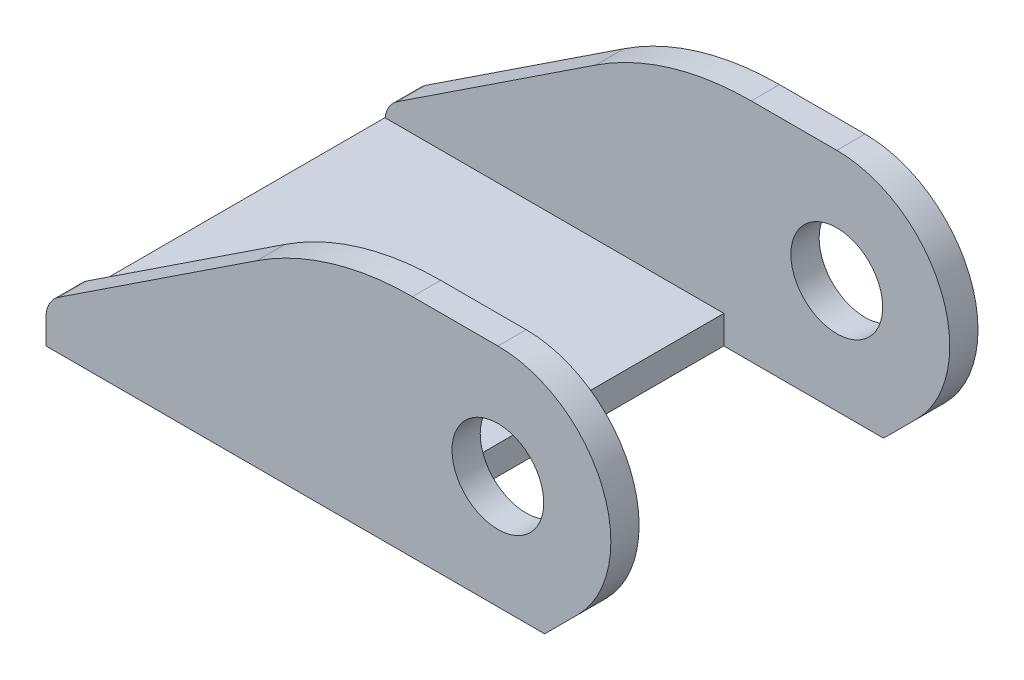
ISO-10303-21;
HEADER;
FILE_DESCRIPTION(('STEP AP214'),'2;1');
FILE_NAME('part.step','',(''),(''),'','','');
FILE_SCHEMA(('AUTOMOTIVE_DESIGN { 1 0 10303 214 1 1 1 1 }'));
ENDSEC;
DATA;
#1=APPLICATION_CONTEXT('core data for automotive mechanical design processes');
#2=APPLICATION_PROTOCOL_DEFINITION('international standard','automotive_design',2000,#1);
#3=PRODUCT_CONTEXT('',#1,'mechanical');
#4=PRODUCT('Part','Part','',(#3));
#5=PRODUCT_RELATED_PRODUCT_CATEGORY('part','',(#4));
#6=PRODUCT_DEFINITION_FORMATION('','',#4);
#7=PRODUCT_DEFINITION_CONTEXT('part definition',#1,'design');
#8=PRODUCT_DEFINITION('design','',#6,#7);
#9=PRODUCT_DEFINITION_SHAPE('','',#8);
#10=(LENGTH_UNIT() NAMED_UNIT(*) SI_UNIT(.MILLI.,.METRE.));
#11=(NAMED_UNIT(*) PLANE_ANGLE_UNIT() SI_UNIT($,.RADIAN.));
#12=(NAMED_UNIT(*) SI_UNIT($,.STERADIAN.) SOLID_ANGLE_UNIT());
#13=UNCERTAINTY_MEASURE_WITH_UNIT(LENGTH_MEASURE(1.E-05),#10,'distance_accuracy_value','');
#14=(GEOMETRIC_REPRESENTATION_CONTEXT(3) GLOBAL_UNCERTAINTY_ASSIGNED_CONTEXT((#13)) GLOBAL_UNIT_ASSIGNED_CONTEXT((#10,
#11,#12)) REPRESENTATION_CONTEXT('',''));
#15=CARTESIAN_POINT('',(0.,0.,0.));
#16=DIRECTION('',(0.,0.,1.));
#17=DIRECTION('',(1.,0.,0.));
#18=AXIS2_PLACEMENT_3D('',#15,#16,#17);
#19=CARTESIAN_POINT('',(3.99993351473138,2.,-13.));
#20=DIRECTION('',(-1.,0.,0.));
#21=DIRECTION('',(0.,0.,1.));
#22=AXIS2_PLACEMENT_3D('',#19,#20,#21);
#23=PLANE('',#22);
#24=DIRECTION('',(0.,1.,0.));
#25=VECTOR('',#24,1.);
#26=CARTESIAN_POINT('',(3.9999335147313,2.,11.));
#27=LINE('',#26,#25);
#28=CARTESIAN_POINT('',(3.9999335147313,0.,11.));
#29=VERTEX_POINT('',#28);
#30=CARTESIAN_POINT('',(3.9999335147313,2.,11.));
#31=VERTEX_POINT('',#30);
#32=EDGE_CURVE('E47',#29,#31,#27,.T.);
#33=ORIENTED_EDGE('',*,*,#32,.F.);
#34=DIRECTION('',(0.,0.,-1.));
#35=VECTOR('',#34,1.);
#36=CARTESIAN_POINT('',(3.99993351473138,0.,-13.));
#37=LINE('',#36,#35);
#38=CARTESIAN_POINT('',(3.99993351473137,0.,-11.));
#39=VERTEX_POINT('',#38);
#40=EDGE_CURVE('E233',#29,#39,#37,.T.);
#41=ORIENTED_EDGE('',*,*,#40,.T.);
#42=DIRECTION('',(0.,1.,0.));
#43=VECTOR('',#42,1.);
#44=CARTESIAN_POINT('',(3.99993351473137,16.,-11.));
#45=LINE('',#44,#43);
#46=CARTESIAN_POINT('',(3.99993351473137,2.,-11.));
#47=VERTEX_POINT('',#46);
#48=EDGE_CURVE('E253',#39,#47,#45,.T.);
#49=ORIENTED_EDGE('',*,*,#48,.T.);
#50=DIRECTION('',(0.,0.,-1.));
#51=VECTOR('',#50,1.);
#52=CARTESIAN_POINT('',(3.99993351473138,2.,-13.));
#53=LINE('',#52,#51);
#54=EDGE_CURVE('E236',#31,#47,#53,.T.);
#55=ORIENTED_EDGE('',*,*,#54,.F.);
#56=EDGE_LOOP('',(#33,#41,#49,#55));
#57=FACE_BOUND('',#56,.T.);
#58=ADVANCED_FACE('F32',(#57),#23,.F.);
#59=CARTESIAN_POINT('',(0.,2.,0.));
#60=DIRECTION('',(0.,1.,0.));
#61=DIRECTION('',(0.,0.,1.));
#62=AXIS2_PLACEMENT_3D('',#59,#60,#61);
#63=PLANE('',#62);
#64=CARTESIAN_POINT('',(-3.00004785437869,2.,0.));
#65=DIRECTION('',(0.,1.,0.));
#66=DIRECTION('',(0.,0.,1.));
#67=AXIS2_PLACEMENT_3D('',#64,#65,#66);
#68=CIRCLE('',#67,1.75);
#69=CARTESIAN_POINT('',(-3.00004785437869,2.,1.75000000000001));
#70=VERTEX_POINT('',#69);
#71=EDGE_CURVE('E224',#70,#70,#68,.T.);
#72=ORIENTED_EDGE('',*,*,#71,.F.);
#73=EDGE_LOOP('',(#72));
#74=FACE_BOUND('',#73,.T.);
#75=CARTESIAN_POINT('',(-13.0000478543787,2.,0.));
#76=DIRECTION('',(0.,1.,0.));
#77=DIRECTION('',(0.,0.,1.));
#78=AXIS2_PLACEMENT_3D('',#75,#76,#77);
#79=CIRCLE('',#78,1.75);
#80=CARTESIAN_POINT('',(-13.0000478543787,2.,1.75));
#81=VERTEX_POINT('',#80);
#82=EDGE_CURVE('E230',#81,#81,#79,.T.);
#83=ORIENTED_EDGE('',*,*,#82,.F.);
#84=EDGE_LOOP('',(#83));
#85=FACE_BOUND('',#84,.T.);
#86=DIRECTION('',(0.,0.,-1.));
#87=VECTOR('',#86,1.);
#88=CARTESIAN_POINT('',(-19.9864100152083,2.,27.));
#89=LINE('',#88,#87);
#90=CARTESIAN_POINT('',(-19.9864100152083,2.,11.));
#91=VERTEX_POINT('',#90);
#92=CARTESIAN_POINT('',(-19.9864100152083,2.,13.));
#93=VERTEX_POINT('',#92);
#94=EDGE_CURVE('E54',#91,#93,#89,.F.);
#95=ORIENTED_EDGE('',*,*,#94,.F.);
#96=DIRECTION('',(1.,0.,0.));
#97=VECTOR('',#96,1.);
#98=CARTESIAN_POINT('',(0.,2.,11.));
#99=LINE('',#98,#97);
#100=EDGE_CURVE('E11',#91,#31,#99,.T.);
#101=ORIENTED_EDGE('',*,*,#100,.T.);
#102=ORIENTED_EDGE('',*,*,#54,.T.);
#103=DIRECTION('',(1.,0.,0.));
#104=VECTOR('',#103,1.);
#105=CARTESIAN_POINT('',(-20.,2.,-11.));
#106=LINE('',#105,#104);
#107=CARTESIAN_POINT('',(-19.9864100152083,2.,-11.));
#108=VERTEX_POINT('',#107);
#109=EDGE_CURVE('E250',#108,#47,#106,.T.);
#110=ORIENTED_EDGE('',*,*,#109,.F.);
#111=DIRECTION('',(0.,0.,1.));
#112=VECTOR('',#111,1.);
#113=CARTESIAN_POINT('',(-19.9864100152083,2.,-27.));
#114=LINE('',#113,#112);
#115=CARTESIAN_POINT('',(-19.9864100152083,2.,-13.));
#116=VERTEX_POINT('',#115);
#117=EDGE_CURVE('E40',#108,#116,#114,.F.);
#118=ORIENTED_EDGE('',*,*,#117,.T.);
#119=DIRECTION('',(-1.,0.,0.));
#120=VECTOR('',#119,1.);
#121=CARTESIAN_POINT('',(-20.,2.,-13.));
#122=LINE('',#121,#120);
#123=CARTESIAN_POINT('',(-20.,2.,-13.));
#124=VERTEX_POINT('',#123);
#125=EDGE_CURVE('E238',#116,#124,#122,.T.);
#126=ORIENTED_EDGE('',*,*,#125,.T.);
#127=DIRECTION('',(0.,0.,1.));
#128=VECTOR('',#127,1.);
#129=CARTESIAN_POINT('',(-20.,2.,-13.));
#130=LINE('',#129,#128);
#131=CARTESIAN_POINT('',(-20.,2.,13.));
#132=VERTEX_POINT('',#131);
#133=EDGE_CURVE('E242',#124,#132,#130,.T.);
#134=ORIENTED_EDGE('',*,*,#133,.T.);
#135=DIRECTION('',(1.,0.,0.));
#136=VECTOR('',#135,1.);
#137=CARTESIAN_POINT('',(-20.,2.,13.));
#138=LINE('',#137,#136);
#139=EDGE_CURVE('E244',#132,#93,#138,.T.);
#140=ORIENTED_EDGE('',*,*,#139,.T.);
#141=EDGE_LOOP('',(#95,#101,#102,#110,#118,#126,#134,#140));
#142=FACE_BOUND('',#141,.T.);
#143=ADVANCED_FACE('F328',(#74,#85,#142),#63,.T.);
#144=CARTESIAN_POINT('',(-20.,16.,-13.));
#145=DIRECTION('',(0.,0.,1.));
#146=DIRECTION('',(-1.,0.,0.));
#147=AXIS2_PLACEMENT_3D('',#144,#145,#146);
#148=PLANE('',#147);
#149=ORIENTED_EDGE('',*,*,#125,.F.);
#150=CARTESIAN_POINT('',(-18.,1.76724422353022,-13.));
#151=DIRECTION('',(0.,0.,-1.));
#152=DIRECTION('',(-1.,0.,0.));
#153=AXIS2_PLACEMENT_3D('',#150,#151,#152);
#154=CIRCLE('',#153,2.);
#155=CARTESIAN_POINT('',(-19.1015173941069,3.43657325954439,-13.));
#156=VERTEX_POINT('',#155);
#157=EDGE_CURVE('E284',#116,#156,#154,.T.);
#158=ORIENTED_EDGE('',*,*,#157,.T.);
#159=DIRECTION('',(0.834664518007086,0.550758697053437,0.));
#160=VECTOR('',#159,1.);
#161=CARTESIAN_POINT('',(-13.9520671778136,6.83447077463097,-13.));
#162=LINE('',#161,#160);
#163=CARTESIAN_POINT('',(-5.07313553026432,12.6932903601417,-13.));
#164=VERTEX_POINT('',#163);
#165=EDGE_CURVE('E286',#156,#164,#162,.T.);
#166=ORIENTED_EDGE('',*,*,#165,.T.);
#167=CARTESIAN_POINT('',(5.94203841080447,-4.,-13.));
#168=DIRECTION('',(0.,0.,-1.));
#169=DIRECTION('',(-1.,0.,0.));
#170=AXIS2_PLACEMENT_3D('',#167,#168,#169);
#171=CIRCLE('',#170,20.);
#172=CARTESIAN_POINT('',(5.94203841080447,16.,-13.));
#173=VERTEX_POINT('',#172);
#174=EDGE_CURVE('E273',#164,#173,#171,.T.);
#175=ORIENTED_EDGE('',*,*,#174,.T.);
#176=DIRECTION('',(1.,0.,0.));
#177=VECTOR('',#176,1.);
#178=CARTESIAN_POINT('',(-20.,16.,-13.));
#179=LINE('',#178,#177);
#180=CARTESIAN_POINT('',(12.,16.,-13.));
#181=VERTEX_POINT('',#180);
#182=EDGE_CURVE('E296',#173,#181,#179,.T.);
#183=ORIENTED_EDGE('',*,*,#182,.T.);
#184=CARTESIAN_POINT('',(12.,8.,-13.));
#185=DIRECTION('',(0.,0.,-1.));
#186=DIRECTION('',(-1.,0.,0.));
#187=AXIS2_PLACEMENT_3D('',#184,#185,#186);
#188=CIRCLE('',#187,8.);
#189=CARTESIAN_POINT('',(17.6568542494924,2.34314575050762,-13.));
#190=VERTEX_POINT('',#189);
#191=EDGE_CURVE('E279',#181,#190,#188,.T.);
#192=ORIENTED_EDGE('',*,*,#191,.T.);
#193=DIRECTION('',(-0.707106781186548,-0.707106781186548,0.));
#194=VECTOR('',#193,1.);
#195=CARTESIAN_POINT('',(5.65685424949238,-9.65685424949238,-13.));
#196=LINE('',#195,#194);
#197=CARTESIAN_POINT('',(15.3137084989848,0.,-13.));
#198=VERTEX_POINT('',#197);
#199=EDGE_CURVE('E267',#190,#198,#196,.T.);
#200=ORIENTED_EDGE('',*,*,#199,.T.);
#201=DIRECTION('',(1.,0.,0.));
#202=VECTOR('',#201,1.);
#203=CARTESIAN_POINT('',(-20.,0.,-13.));
#204=LINE('',#203,#202);
#205=CARTESIAN_POINT('',(-20.,0.,-13.));
#206=VERTEX_POINT('',#205);
#207=EDGE_CURVE('E302',#206,#198,#204,.T.);
#208=ORIENTED_EDGE('',*,*,#207,.F.);
#209=DIRECTION('',(0.,-1.,0.));
#210=VECTOR('',#209,1.);
#211=CARTESIAN_POINT('',(-20.,16.,-13.));
#212=LINE('',#211,#210);
#213=EDGE_CURVE('E306',#124,#206,#212,.T.);
#214=ORIENTED_EDGE('',*,*,#213,.F.);
#215=EDGE_LOOP('',(#149,#158,#166,#175,#183,#192,#200,#208,#214));
#216=FACE_BOUND('',#215,.T.);
#217=CARTESIAN_POINT('',(12.,8.,-13.));
#218=DIRECTION('',(0.,0.,-1.));
#219=DIRECTION('',(-1.,0.,0.));
#220=AXIS2_PLACEMENT_3D('',#217,#218,#219);
#221=CIRCLE('',#220,3.25);
#222=CARTESIAN_POINT('',(8.75,8.,-13.));
#223=VERTEX_POINT('',#222);
#224=EDGE_CURVE('E290',#223,#223,#221,.T.);
#225=ORIENTED_EDGE('',*,*,#224,.F.);
#226=EDGE_LOOP('',(#225));
#227=FACE_BOUND('',#226,.T.);
#228=ADVANCED_FACE('F333',(#216,#227),#148,.F.);
#229=CARTESIAN_POINT('',(-20.,16.,-11.));
#230=DIRECTION('',(0.,0.,-1.));
#231=DIRECTION('',(1.,0.,0.));
#232=AXIS2_PLACEMENT_3D('',#229,#230,#231);
#233=PLANE('',#232);
#234=CARTESIAN_POINT('',(12.,8.,-11.));
#235=DIRECTION('',(0.,0.,-1.));
#236=DIRECTION('',(-1.,0.,0.));
#237=AXIS2_PLACEMENT_3D('',#234,#235,#236);
#238=CIRCLE('',#237,3.25);
#239=CARTESIAN_POINT('',(8.75,8.,-11.));
#240=VERTEX_POINT('',#239);
#241=EDGE_CURVE('E289',#240,#240,#238,.T.);
#242=ORIENTED_EDGE('',*,*,#241,.T.);
#243=EDGE_LOOP('',(#242));
#244=FACE_BOUND('',#243,.T.);
#245=CARTESIAN_POINT('',(-18.,1.76724422353022,-11.));
#246=DIRECTION('',(0.,0.,-1.));
#247=DIRECTION('',(-1.,0.,0.));
#248=AXIS2_PLACEMENT_3D('',#245,#246,#247);
#249=CIRCLE('',#248,2.);
#250=CARTESIAN_POINT('',(-19.1015173941069,3.43657325954439,-11.));
#251=VERTEX_POINT('',#250);
#252=EDGE_CURVE('E316',#251,#108,#249,.F.);
#253=ORIENTED_EDGE('',*,*,#252,.T.);
#254=ORIENTED_EDGE('',*,*,#109,.T.);
#255=ORIENTED_EDGE('',*,*,#48,.F.);
#256=DIRECTION('',(-1.,0.,0.));
#257=VECTOR('',#256,1.);
#258=CARTESIAN_POINT('',(-20.,0.,-11.));
#259=LINE('',#258,#257);
#260=CARTESIAN_POINT('',(15.3137084989848,0.,-11.));
#261=VERTEX_POINT('',#260);
#262=EDGE_CURVE('E300',#261,#39,#259,.T.);
#263=ORIENTED_EDGE('',*,*,#262,.F.);
#264=DIRECTION('',(0.707106781186548,0.707106781186548,0.));
#265=VECTOR('',#264,1.);
#266=CARTESIAN_POINT('',(5.65685424949238,-9.65685424949238,-11.));
#267=LINE('',#266,#265);
#268=CARTESIAN_POINT('',(17.6568542494924,2.34314575050762,-10.999994));
#269=VERTEX_POINT('',#268);
#270=EDGE_CURVE('E261',#261,#269,#267,.T.);
#271=ORIENTED_EDGE('',*,*,#270,.T.);
#272=CARTESIAN_POINT('',(12.,8.,-11.));
#273=DIRECTION('',(0.,0.,1.));
#274=DIRECTION('',(1.,0.,0.));
#275=AXIS2_PLACEMENT_3D('',#272,#273,#274);
#276=CIRCLE('',#275,8.);
#277=CARTESIAN_POINT('',(12.,16.,-11.));
#278=VERTEX_POINT('',#277);
#279=EDGE_CURVE('E276',#269,#278,#276,.T.);
#280=ORIENTED_EDGE('',*,*,#279,.T.);
#281=DIRECTION('',(1.,0.,0.));
#282=VECTOR('',#281,1.);
#283=CARTESIAN_POINT('',(0.,16.,-11.));
#284=LINE('',#283,#282);
#285=CARTESIAN_POINT('',(5.94203841080447,16.,-11.));
#286=VERTEX_POINT('',#285);
#287=EDGE_CURVE('E299',#278,#286,#284,.F.);
#288=ORIENTED_EDGE('',*,*,#287,.T.);
#289=CARTESIAN_POINT('',(5.94203841080447,-4.,-11.));
#290=DIRECTION('',(0.,0.,-1.));
#291=DIRECTION('',(-1.,0.,0.));
#292=AXIS2_PLACEMENT_3D('',#289,#290,#291);
#293=CIRCLE('',#292,20.);
#294=CARTESIAN_POINT('',(-5.07313553026429,12.6932903601417,-11.));
#295=VERTEX_POINT('',#294);
#296=EDGE_CURVE('E272',#295,#286,#293,.T.);
#297=ORIENTED_EDGE('',*,*,#296,.F.);
#298=DIRECTION('',(-0.834664518007086,-0.550758697053437,0.));
#299=VECTOR('',#298,1.);
#300=CARTESIAN_POINT('',(-19.1015173941069,3.43657325954439,-11.));
#301=LINE('',#300,#299);
#302=EDGE_CURVE('E319',#295,#251,#301,.T.);
#303=ORIENTED_EDGE('',*,*,#302,.T.);
#304=EDGE_LOOP('',(#253,#254,#255,#263,#271,#280,#288,#297,#303));
#305=FACE_BOUND('',#304,.T.);
#306=ADVANCED_FACE('F374',(#244,#305),#233,.F.);
#307=CARTESIAN_POINT('',(0.,16.,0.));
#308=DIRECTION('',(0.,-1.,0.));
#309=DIRECTION('',(0.,0.,1.));
#310=AXIS2_PLACEMENT_3D('',#307,#308,#309);
#311=PLANE('',#310);
#312=ORIENTED_EDGE('',*,*,#182,.F.);
#313=DIRECTION('',(0.,0.,1.));
#314=VECTOR('',#313,1.);
#315=CARTESIAN_POINT('',(5.94203841080447,16.,-27.));
#316=LINE('',#315,#314);
#317=EDGE_CURVE('E312',#173,#286,#316,.T.);
#318=ORIENTED_EDGE('',*,*,#317,.T.);
#319=ORIENTED_EDGE('',*,*,#287,.F.);
#320=DIRECTION('',(0.,0.,1.));
#321=VECTOR('',#320,1.);
#322=CARTESIAN_POINT('',(12.,16.,-27.));
#323=LINE('',#322,#321);
#324=EDGE_CURVE('E314',#181,#278,#323,.T.);
#325=ORIENTED_EDGE('',*,*,#324,.F.);
#326=EDGE_LOOP('',(#312,#318,#319,#325));
#327=FACE_BOUND('',#326,.T.);
#328=ADVANCED_FACE('F387',(#327),#311,.F.);
#329=CARTESIAN_POINT('',(0.,0.,0.));
#330=DIRECTION('',(0.,-1.,0.));
#331=DIRECTION('',(0.,0.,1.));
#332=AXIS2_PLACEMENT_3D('',#329,#330,#331);
#333=PLANE('',#332);
#334=DIRECTION('',(0.,0.,-1.));
#335=VECTOR('',#334,1.);
#336=CARTESIAN_POINT('',(-20.,0.,-13.));
#337=LINE('',#336,#335);
#338=CARTESIAN_POINT('',(-20.,0.,13.));
#339=VERTEX_POINT('',#338);
#340=EDGE_CURVE('E293',#339,#206,#337,.T.);
#341=ORIENTED_EDGE('',*,*,#340,.T.);
#342=ORIENTED_EDGE('',*,*,#207,.T.);
#343=DIRECTION('',(0.,0.,-1.));
#344=VECTOR('',#343,1.);
#345=CARTESIAN_POINT('',(15.3137084989848,0.,0.));
#346=LINE('',#345,#344);
#347=EDGE_CURVE('E309',#261,#198,#346,.T.);
#348=ORIENTED_EDGE('',*,*,#347,.F.);
#349=ORIENTED_EDGE('',*,*,#262,.T.);
#350=ORIENTED_EDGE('',*,*,#40,.F.);
#351=DIRECTION('',(-1.,0.,0.));
#352=VECTOR('',#351,1.);
#353=CARTESIAN_POINT('',(-20.,0.,11.));
#354=LINE('',#353,#352);
#355=CARTESIAN_POINT('',(15.3137084989848,0.,11.));
#356=VERTEX_POINT('',#355);
#357=EDGE_CURVE('E202',#356,#29,#354,.T.);
#358=ORIENTED_EDGE('',*,*,#357,.F.);
#359=DIRECTION('',(0.,0.,1.));
#360=VECTOR('',#359,1.);
#361=CARTESIAN_POINT('',(15.3137084989848,0.,0.));
#362=LINE('',#361,#360);
#363=CARTESIAN_POINT('',(15.3137084989848,0.,13.));
#364=VERTEX_POINT('',#363);
#365=EDGE_CURVE('E164',#356,#364,#362,.T.);
#366=ORIENTED_EDGE('',*,*,#365,.T.);
#367=DIRECTION('',(1.,0.,0.));
#368=VECTOR('',#367,1.);
#369=CARTESIAN_POINT('',(-20.,0.,13.));
#370=LINE('',#369,#368);
#371=EDGE_CURVE('E239',#339,#364,#370,.T.);
#372=ORIENTED_EDGE('',*,*,#371,.F.);
#373=EDGE_LOOP('',(#341,#342,#348,#349,#350,#358,#366,#372));
#374=FACE_BOUND('',#373,.T.);
#375=CARTESIAN_POINT('',(-13.0000478543787,0.,0.));
#376=DIRECTION('',(0.,1.,0.));
#377=DIRECTION('',(0.,0.,1.));
#378=AXIS2_PLACEMENT_3D('',#375,#376,#377);
#379=CIRCLE('',#378,1.75);
#380=CARTESIAN_POINT('',(-13.0000478543787,0.,1.75));
#381=VERTEX_POINT('',#380);
#382=EDGE_CURVE('E227',#381,#381,#379,.T.);
#383=ORIENTED_EDGE('',*,*,#382,.T.);
#384=EDGE_LOOP('',(#383));
#385=FACE_BOUND('',#384,.T.);
#386=CARTESIAN_POINT('',(-3.00004785437869,0.,0.));
#387=DIRECTION('',(0.,1.,0.));
#388=DIRECTION('',(0.,0.,1.));
#389=AXIS2_PLACEMENT_3D('',#386,#387,#388);
#390=CIRCLE('',#389,1.75);
#391=CARTESIAN_POINT('',(-3.00004785437869,0.,1.75000000000001));
#392=VERTEX_POINT('',#391);
#393=EDGE_CURVE('E223',#392,#392,#390,.T.);
#394=ORIENTED_EDGE('',*,*,#393,.T.);
#395=EDGE_LOOP('',(#394));
#396=FACE_BOUND('',#395,.T.);
#397=ADVANCED_FACE('F369',(#374,#385,#396),#333,.T.);
#398=CARTESIAN_POINT('',(-20.,16.,-13.));
#399=DIRECTION('',(1.,0.,0.));
#400=DIRECTION('',(0.,0.,1.));
#401=AXIS2_PLACEMENT_3D('',#398,#399,#400);
#402=PLANE('',#401);
#403=ORIENTED_EDGE('',*,*,#213,.T.);
#404=ORIENTED_EDGE('',*,*,#340,.F.);
#405=DIRECTION('',(0.,-1.,0.));
#406=VECTOR('',#405,1.);
#407=CARTESIAN_POINT('',(-20.,2.,13.));
#408=LINE('',#407,#406);
#409=EDGE_CURVE('E246',#132,#339,#408,.T.);
#410=ORIENTED_EDGE('',*,*,#409,.F.);
#411=ORIENTED_EDGE('',*,*,#133,.F.);
#412=EDGE_LOOP('',(#403,#404,#410,#411));
#413=FACE_BOUND('',#412,.T.);
#414=ADVANCED_FACE('F34',(#413),#402,.F.);
#415=CARTESIAN_POINT('',(12.,8.,-13.));
#416=DIRECTION('',(0.,0.,1.));
#417=DIRECTION('',(-1.,0.,0.));
#418=AXIS2_PLACEMENT_3D('',#415,#416,#417);
#419=CYLINDRICAL_SURFACE('',#418,3.25);
#420=ORIENTED_EDGE('',*,*,#224,.T.);
#421=EDGE_LOOP('',(#420));
#422=FACE_BOUND('',#421,.T.);
#423=ORIENTED_EDGE('',*,*,#241,.F.);
#424=EDGE_LOOP('',(#423));
#425=FACE_BOUND('',#424,.T.);
#426=ADVANCED_FACE('F544',(#422,#425),#419,.F.);
#427=CARTESIAN_POINT('',(17.6568542494924,2.34314575050762,-27.));
#428=DIRECTION('',(0.707106781186547,-0.707106781186547,0.));
#429=DIRECTION('',(0.707106781186548,0.707106781186548,0.));
#430=AXIS2_PLACEMENT_3D('',#427,#428,#429);
#431=PLANE('',#430);
#432=ORIENTED_EDGE('',*,*,#199,.F.);
#433=DIRECTION('',(0.,0.,1.));
#434=VECTOR('',#433,1.);
#435=CARTESIAN_POINT('',(17.6568542494924,2.34314575050762,-27.));
#436=LINE('',#435,#434);
#437=EDGE_CURVE('E256',#190,#269,#436,.T.);
#438=ORIENTED_EDGE('',*,*,#437,.T.);
#439=ORIENTED_EDGE('',*,*,#270,.F.);
#440=ORIENTED_EDGE('',*,*,#347,.T.);
#441=EDGE_LOOP('',(#432,#438,#439,#440));
#442=FACE_BOUND('',#441,.T.);
#443=ADVANCED_FACE('F378',(#442),#431,.T.);
#444=CARTESIAN_POINT('',(12.,8.,-27.));
#445=DIRECTION('',(0.,0.,1.));
#446=DIRECTION('',(-1.,0.,0.));
#447=AXIS2_PLACEMENT_3D('',#444,#445,#446);
#448=CYLINDRICAL_SURFACE('',#447,8.);
#449=ORIENTED_EDGE('',*,*,#191,.F.);
#450=ORIENTED_EDGE('',*,*,#324,.T.);
#451=ORIENTED_EDGE('',*,*,#279,.F.);
#452=ORIENTED_EDGE('',*,*,#437,.F.);
#453=EDGE_LOOP('',(#449,#450,#451,#452));
#454=FACE_BOUND('',#453,.T.);
#455=ADVANCED_FACE('F384',(#454),#448,.T.);
#456=CARTESIAN_POINT('',(-19.1015173941069,3.43657325954439,-27.));
#457=DIRECTION('',(-0.550758697053437,0.834664518007086,0.));
#458=DIRECTION('',(-0.834664518007086,-0.550758697053437,0.));
#459=AXIS2_PLACEMENT_3D('',#456,#457,#458);
#460=PLANE('',#459);
#461=ORIENTED_EDGE('',*,*,#165,.F.);
#462=DIRECTION('',(0.,0.,1.));
#463=VECTOR('',#462,1.);
#464=CARTESIAN_POINT('',(-19.1015173941069,3.43657325954439,-27.));
#465=LINE('',#464,#463);
#466=EDGE_CURVE('E257',#156,#251,#465,.T.);
#467=ORIENTED_EDGE('',*,*,#466,.T.);
#468=ORIENTED_EDGE('',*,*,#302,.F.);
#469=DIRECTION('',(0.,0.,1.));
#470=VECTOR('',#469,1.);
#471=CARTESIAN_POINT('',(-5.07313553026432,12.6932903601417,-27.));
#472=LINE('',#471,#470);
#473=EDGE_CURVE('E259',#164,#295,#472,.T.);
#474=ORIENTED_EDGE('',*,*,#473,.F.);
#475=EDGE_LOOP('',(#461,#467,#468,#474));
#476=FACE_BOUND('',#475,.T.);
#477=ADVANCED_FACE('F394',(#476),#460,.T.);
#478=CARTESIAN_POINT('',(-18.,1.76724422353022,-27.));
#479=DIRECTION('',(0.,0.,1.));
#480=DIRECTION('',(-1.,0.,0.));
#481=AXIS2_PLACEMENT_3D('',#478,#479,#480);
#482=CYLINDRICAL_SURFACE('',#481,2.);
#483=ORIENTED_EDGE('',*,*,#117,.F.);
#484=ORIENTED_EDGE('',*,*,#252,.F.);
#485=ORIENTED_EDGE('',*,*,#466,.F.);
#486=ORIENTED_EDGE('',*,*,#157,.F.);
#487=EDGE_LOOP('',(#483,#484,#485,#486));
#488=FACE_BOUND('',#487,.T.);
#489=ADVANCED_FACE('F395',(#488),#482,.T.);
#490=CARTESIAN_POINT('',(5.94203841080447,-4.,-27.));
#491=DIRECTION('',(0.,0.,1.));
#492=DIRECTION('',(-1.,0.,0.));
#493=AXIS2_PLACEMENT_3D('',#490,#491,#492);
#494=CYLINDRICAL_SURFACE('',#493,20.);
#495=ORIENTED_EDGE('',*,*,#174,.F.);
#496=ORIENTED_EDGE('',*,*,#473,.T.);
#497=ORIENTED_EDGE('',*,*,#296,.T.);
#498=ORIENTED_EDGE('',*,*,#317,.F.);
#499=EDGE_LOOP('',(#495,#496,#497,#498));
#500=FACE_BOUND('',#499,.T.);
#501=ADVANCED_FACE('F390',(#500),#494,.T.);
#502=CARTESIAN_POINT('',(-20.,2.,13.));
#503=DIRECTION('',(0.,0.,-1.));
#504=DIRECTION('',(-1.,0.,0.));
#505=AXIS2_PLACEMENT_3D('',#502,#503,#504);
#506=PLANE('',#505);
#507=ORIENTED_EDGE('',*,*,#371,.T.);
#508=DIRECTION('',(-0.707106781186548,-0.707106781186548,0.));
#509=VECTOR('',#508,1.);
#510=CARTESIAN_POINT('',(5.65685424949238,-9.65685424949238,13.));
#511=LINE('',#510,#509);
#512=CARTESIAN_POINT('',(17.6568542494924,2.34314575050762,13.));
#513=VERTEX_POINT('',#512);
#514=EDGE_CURVE('E169',#513,#364,#511,.T.);
#515=ORIENTED_EDGE('',*,*,#514,.F.);
#516=CARTESIAN_POINT('',(12.,8.,13.));
#517=DIRECTION('',(0.,0.,-1.));
#518=DIRECTION('',(-1.,0.,0.));
#519=AXIS2_PLACEMENT_3D('',#516,#517,#518);
#520=CIRCLE('',#519,8.);
#521=CARTESIAN_POINT('',(12.,16.,13.));
#522=VERTEX_POINT('',#521);
#523=EDGE_CURVE('E177',#522,#513,#520,.T.);
#524=ORIENTED_EDGE('',*,*,#523,.F.);
#525=DIRECTION('',(1.,0.,0.));
#526=VECTOR('',#525,1.);
#527=CARTESIAN_POINT('',(-20.,16.,13.));
#528=LINE('',#527,#526);
#529=CARTESIAN_POINT('',(5.94203841080447,16.,13.));
#530=VERTEX_POINT('',#529);
#531=EDGE_CURVE('E205',#530,#522,#528,.T.);
#532=ORIENTED_EDGE('',*,*,#531,.F.);
#533=CARTESIAN_POINT('',(5.94203841080447,-4.,13.));
#534=DIRECTION('',(0.,0.,-1.));
#535=DIRECTION('',(-1.,0.,0.));
#536=AXIS2_PLACEMENT_3D('',#533,#534,#535);
#537=CIRCLE('',#536,20.);
#538=CARTESIAN_POINT('',(-5.07313553026432,12.6932903601417,13.));
#539=VERTEX_POINT('',#538);
#540=EDGE_CURVE('E185',#539,#530,#537,.T.);
#541=ORIENTED_EDGE('',*,*,#540,.F.);
#542=DIRECTION('',(0.834664518007086,0.550758697053437,0.));
#543=VECTOR('',#542,1.);
#544=CARTESIAN_POINT('',(-13.9520671778136,6.83447077463097,13.));
#545=LINE('',#544,#543);
#546=CARTESIAN_POINT('',(-19.1015173941069,3.43657325954439,13.));
#547=VERTEX_POINT('',#546);
#548=EDGE_CURVE('E196',#547,#539,#545,.T.);
#549=ORIENTED_EDGE('',*,*,#548,.F.);
#550=CARTESIAN_POINT('',(-18.,1.76724422353022,13.));
#551=DIRECTION('',(0.,0.,-1.));
#552=DIRECTION('',(-1.,0.,0.));
#553=AXIS2_PLACEMENT_3D('',#550,#551,#552);
#554=CIRCLE('',#553,2.);
#555=EDGE_CURVE('E187',#93,#547,#554,.T.);
#556=ORIENTED_EDGE('',*,*,#555,.F.);
#557=ORIENTED_EDGE('',*,*,#139,.F.);
#558=ORIENTED_EDGE('',*,*,#409,.T.);
#559=EDGE_LOOP('',(#507,#515,#524,#532,#541,#549,#556,#557,#558));
#560=FACE_BOUND('',#559,.T.);
#561=CARTESIAN_POINT('',(12.,8.,13.));
#562=DIRECTION('',(0.,0.,-1.));
#563=DIRECTION('',(-1.,0.,0.));
#564=AXIS2_PLACEMENT_3D('',#561,#562,#563);
#565=CIRCLE('',#564,3.25);
#566=CARTESIAN_POINT('',(8.75,8.,13.));
#567=VERTEX_POINT('',#566);
#568=EDGE_CURVE('E199',#567,#567,#565,.T.);
#569=ORIENTED_EDGE('',*,*,#568,.T.);
#570=EDGE_LOOP('',(#569));
#571=FACE_BOUND('',#570,.T.);
#572=ADVANCED_FACE('F350',(#560,#571),#506,.F.);
#573=CARTESIAN_POINT('',(-13.0000478543787,2.,0.));
#574=DIRECTION('',(0.,-1.,0.));
#575=DIRECTION('',(0.,0.,-1.));
#576=AXIS2_PLACEMENT_3D('',#573,#574,#575);
#577=CYLINDRICAL_SURFACE('',#576,1.75);
#578=ORIENTED_EDGE('',*,*,#82,.T.);
#579=EDGE_LOOP('',(#578));
#580=FACE_BOUND('',#579,.T.);
#581=ORIENTED_EDGE('',*,*,#382,.F.);
#582=EDGE_LOOP('',(#581));
#583=FACE_BOUND('',#582,.T.);
#584=ADVANCED_FACE('F414',(#580,#583),#577,.F.);
#585=CARTESIAN_POINT('',(-3.00004785437869,2.,0.));
#586=DIRECTION('',(0.,-1.,0.));
#587=DIRECTION('',(0.,0.,-1.));
#588=AXIS2_PLACEMENT_3D('',#585,#586,#587);
#589=CYLINDRICAL_SURFACE('',#588,1.75);
#590=ORIENTED_EDGE('',*,*,#71,.T.);
#591=EDGE_LOOP('',(#590));
#592=FACE_BOUND('',#591,.T.);
#593=ORIENTED_EDGE('',*,*,#393,.F.);
#594=EDGE_LOOP('',(#593));
#595=FACE_BOUND('',#594,.T.);
#596=ADVANCED_FACE('F418',(#592,#595),#589,.F.);
#597=CARTESIAN_POINT('',(-20.,16.,11.));
#598=DIRECTION('',(0.,0.,1.));
#599=DIRECTION('',(1.,0.,0.));
#600=AXIS2_PLACEMENT_3D('',#597,#598,#599);
#601=PLANE('',#600);
#602=CARTESIAN_POINT('',(12.,8.,11.));
#603=DIRECTION('',(0.,0.,-1.));
#604=DIRECTION('',(-1.,0.,0.));
#605=AXIS2_PLACEMENT_3D('',#602,#603,#604);
#606=CIRCLE('',#605,3.25);
#607=CARTESIAN_POINT('',(8.75,8.,11.));
#608=VERTEX_POINT('',#607);
#609=EDGE_CURVE('E198',#608,#608,#606,.T.);
#610=ORIENTED_EDGE('',*,*,#609,.F.);
#611=EDGE_LOOP('',(#610));
#612=FACE_BOUND('',#611,.T.);
#613=ORIENTED_EDGE('',*,*,#357,.T.);
#614=ORIENTED_EDGE('',*,*,#32,.T.);
#615=ORIENTED_EDGE('',*,*,#100,.F.);
#616=CARTESIAN_POINT('',(-18.,1.76724422353022,11.));
#617=DIRECTION('',(0.,0.,-1.));
#618=DIRECTION('',(-1.,0.,0.));
#619=AXIS2_PLACEMENT_3D('',#616,#617,#618);
#620=CIRCLE('',#619,2.);
#621=CARTESIAN_POINT('',(-19.1015173941069,3.43657325954439,11.));
#622=VERTEX_POINT('',#621);
#623=EDGE_CURVE('E214',#622,#91,#620,.F.);
#624=ORIENTED_EDGE('',*,*,#623,.F.);
#625=DIRECTION('',(-0.834664518007086,-0.550758697053437,0.));
#626=VECTOR('',#625,1.);
#627=CARTESIAN_POINT('',(-19.1015173941069,3.43657325954439,11.));
#628=LINE('',#627,#626);
#629=CARTESIAN_POINT('',(-5.07313553026429,12.6932903601417,11.));
#630=VERTEX_POINT('',#629);
#631=EDGE_CURVE('E217',#630,#622,#628,.T.);
#632=ORIENTED_EDGE('',*,*,#631,.F.);
#633=CARTESIAN_POINT('',(5.94203841080447,-4.,11.));
#634=DIRECTION('',(0.,0.,-1.));
#635=DIRECTION('',(-1.,0.,0.));
#636=AXIS2_PLACEMENT_3D('',#633,#634,#635);
#637=CIRCLE('',#636,20.);
#638=CARTESIAN_POINT('',(5.94203841080447,16.,11.));
#639=VERTEX_POINT('',#638);
#640=EDGE_CURVE('E189',#630,#639,#637,.T.);
#641=ORIENTED_EDGE('',*,*,#640,.T.);
#642=DIRECTION('',(1.,0.,0.));
#643=VECTOR('',#642,1.);
#644=CARTESIAN_POINT('',(0.,16.,11.));
#645=LINE('',#644,#643);
#646=CARTESIAN_POINT('',(12.,16.,11.));
#647=VERTEX_POINT('',#646);
#648=EDGE_CURVE('E184',#647,#639,#645,.F.);
#649=ORIENTED_EDGE('',*,*,#648,.F.);
#650=CARTESIAN_POINT('',(12.,8.,11.));
#651=DIRECTION('',(0.,0.,1.));
#652=DIRECTION('',(1.,0.,0.));
#653=AXIS2_PLACEMENT_3D('',#650,#651,#652);
#654=CIRCLE('',#653,8.);
#655=CARTESIAN_POINT('',(17.6568542494924,2.34314575050762,10.999994));
#656=VERTEX_POINT('',#655);
#657=EDGE_CURVE('E174',#656,#647,#654,.T.);
#658=ORIENTED_EDGE('',*,*,#657,.F.);
#659=DIRECTION('',(0.707106781186548,0.707106781186548,0.));
#660=VECTOR('',#659,1.);
#661=CARTESIAN_POINT('',(5.65685424949238,-9.65685424949238,11.));
#662=LINE('',#661,#660);
#663=EDGE_CURVE('E157',#356,#656,#662,.T.);
#664=ORIENTED_EDGE('',*,*,#663,.F.);
#665=EDGE_LOOP('',(#613,#614,#615,#624,#632,#641,#649,#658,#664));
#666=FACE_BOUND('',#665,.T.);
#667=ADVANCED_FACE('F181',(#612,#666),#601,.F.);
#668=CARTESIAN_POINT('',(0.,16.,0.));
#669=DIRECTION('',(0.,-1.,0.));
#670=DIRECTION('',(0.,0.,-1.));
#671=AXIS2_PLACEMENT_3D('',#668,#669,#670);
#672=PLANE('',#671);
#673=ORIENTED_EDGE('',*,*,#531,.T.);
#674=DIRECTION('',(0.,0.,-1.));
#675=VECTOR('',#674,1.);
#676=CARTESIAN_POINT('',(12.,16.,27.));
#677=LINE('',#676,#675);
#678=EDGE_CURVE('E212',#522,#647,#677,.T.);
#679=ORIENTED_EDGE('',*,*,#678,.T.);
#680=ORIENTED_EDGE('',*,*,#648,.T.);
#681=DIRECTION('',(0.,0.,-1.));
#682=VECTOR('',#681,1.);
#683=CARTESIAN_POINT('',(5.94203841080447,16.,27.));
#684=LINE('',#683,#682);
#685=EDGE_CURVE('E210',#530,#639,#684,.T.);
#686=ORIENTED_EDGE('',*,*,#685,.F.);
#687=EDGE_LOOP('',(#673,#679,#680,#686));
#688=FACE_BOUND('',#687,.T.);
#689=ADVANCED_FACE('F425',(#688),#672,.F.);
#690=CARTESIAN_POINT('',(12.,8.,13.));
#691=DIRECTION('',(0.,0.,-1.));
#692=DIRECTION('',(-1.,0.,0.));
#693=AXIS2_PLACEMENT_3D('',#690,#691,#692);
#694=CYLINDRICAL_SURFACE('',#693,3.25);
#695=ORIENTED_EDGE('',*,*,#568,.F.);
#696=EDGE_LOOP('',(#695));
#697=FACE_BOUND('',#696,.T.);
#698=ORIENTED_EDGE('',*,*,#609,.T.);
#699=EDGE_LOOP('',(#698));
#700=FACE_BOUND('',#699,.T.);
#701=ADVANCED_FACE('F429',(#697,#700),#694,.F.);
#702=CARTESIAN_POINT('',(17.6568542494924,2.34314575050762,27.));
#703=DIRECTION('',(0.707106781186547,-0.707106781186547,0.));
#704=DIRECTION('',(0.707106781186548,0.707106781186548,0.));
#705=AXIS2_PLACEMENT_3D('',#702,#703,#704);
#706=PLANE('',#705);
#707=ORIENTED_EDGE('',*,*,#514,.T.);
#708=ORIENTED_EDGE('',*,*,#365,.F.);
#709=ORIENTED_EDGE('',*,*,#663,.T.);
#710=DIRECTION('',(0.,0.,-1.));
#711=VECTOR('',#710,1.);
#712=CARTESIAN_POINT('',(17.6568542494924,2.34314575050762,27.));
#713=LINE('',#712,#711);
#714=EDGE_CURVE('E161',#513,#656,#713,.T.);
#715=ORIENTED_EDGE('',*,*,#714,.F.);
#716=EDGE_LOOP('',(#707,#708,#709,#715));
#717=FACE_BOUND('',#716,.T.);
#718=ADVANCED_FACE('F160',(#717),#706,.T.);
#719=CARTESIAN_POINT('',(12.,8.,27.));
#720=DIRECTION('',(0.,0.,-1.));
#721=DIRECTION('',(-1.,0.,0.));
#722=AXIS2_PLACEMENT_3D('',#719,#720,#721);
#723=CYLINDRICAL_SURFACE('',#722,8.);
#724=ORIENTED_EDGE('',*,*,#523,.T.);
#725=ORIENTED_EDGE('',*,*,#714,.T.);
#726=ORIENTED_EDGE('',*,*,#657,.T.);
#727=ORIENTED_EDGE('',*,*,#678,.F.);
#728=EDGE_LOOP('',(#724,#725,#726,#727));
#729=FACE_BOUND('',#728,.T.);
#730=ADVANCED_FACE('F173',(#729),#723,.T.);
#731=CARTESIAN_POINT('',(-19.1015173941069,3.43657325954439,27.));
#732=DIRECTION('',(-0.550758697053437,0.834664518007086,0.));
#733=DIRECTION('',(-0.834664518007086,-0.550758697053437,0.));
#734=AXIS2_PLACEMENT_3D('',#731,#732,#733);
#735=PLANE('',#734);
#736=ORIENTED_EDGE('',*,*,#548,.T.);
#737=DIRECTION('',(0.,0.,-1.));
#738=VECTOR('',#737,1.);
#739=CARTESIAN_POINT('',(-5.07313553026432,12.6932903601417,27.));
#740=LINE('',#739,#738);
#741=EDGE_CURVE('E170',#539,#630,#740,.T.);
#742=ORIENTED_EDGE('',*,*,#741,.T.);
#743=ORIENTED_EDGE('',*,*,#631,.T.);
#744=DIRECTION('',(0.,0.,-1.));
#745=VECTOR('',#744,1.);
#746=CARTESIAN_POINT('',(-19.1015173941069,3.43657325954439,27.));
#747=LINE('',#746,#745);
#748=EDGE_CURVE('E178',#547,#622,#747,.T.);
#749=ORIENTED_EDGE('',*,*,#748,.F.);
#750=EDGE_LOOP('',(#736,#742,#743,#749));
#751=FACE_BOUND('',#750,.T.);
#752=ADVANCED_FACE('F357',(#751),#735,.T.);
#753=CARTESIAN_POINT('',(-18.,1.76724422353022,27.));
#754=DIRECTION('',(0.,0.,-1.));
#755=DIRECTION('',(-1.,0.,0.));
#756=AXIS2_PLACEMENT_3D('',#753,#754,#755);
#757=CYLINDRICAL_SURFACE('',#756,2.);
#758=ORIENTED_EDGE('',*,*,#623,.T.);
#759=ORIENTED_EDGE('',*,*,#94,.T.);
#760=ORIENTED_EDGE('',*,*,#555,.T.);
#761=ORIENTED_EDGE('',*,*,#748,.T.);
#762=EDGE_LOOP('',(#758,#759,#760,#761));
#763=FACE_BOUND('',#762,.T.);
#764=ADVANCED_FACE('F345',(#763),#757,.T.);
#765=CARTESIAN_POINT('',(5.94203841080447,-4.,27.));
#766=DIRECTION('',(0.,0.,-1.));
#767=DIRECTION('',(-1.,0.,0.));
#768=AXIS2_PLACEMENT_3D('',#765,#766,#767);
#769=CYLINDRICAL_SURFACE('',#768,20.);
#770=ORIENTED_EDGE('',*,*,#540,.T.);
#771=ORIENTED_EDGE('',*,*,#685,.T.);
#772=ORIENTED_EDGE('',*,*,#640,.F.);
#773=ORIENTED_EDGE('',*,*,#741,.F.);
#774=EDGE_LOOP('',(#770,#771,#772,#773));
#775=FACE_BOUND('',#774,.T.);
#776=ADVANCED_FACE('F360',(#775),#769,.T.);
#777=CLOSED_SHELL('',(#58,#143,#228,#306,#328,#397,#414,#426,#443,#455,#477,#489,#501,#572,#584,
#596,#667,#689,#701,#718,#730,#752,#764,#776));
#778=MANIFOLD_SOLID_BREP('B2',#777);
#779=ADVANCED_BREP_SHAPE_REPRESENTATION('',(#18,#778),#14);
#780=SHAPE_DEFINITION_REPRESENTATION(#9,#779);
ENDSEC;
END-ISO-10303-21;
